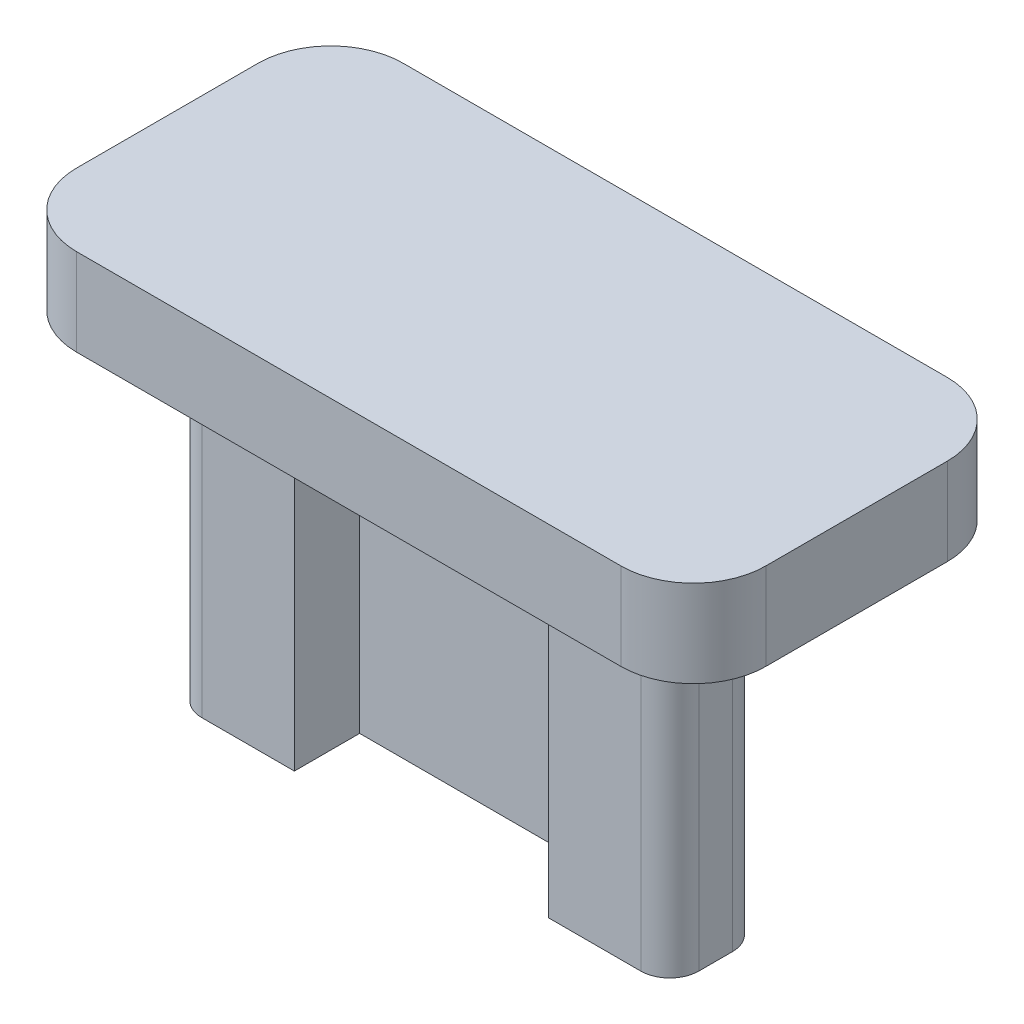
ISO-10303-21;
HEADER;
FILE_DESCRIPTION(('STEP AP214'),'2;1');
FILE_NAME('part.step','',(''),(''),'','','');
FILE_SCHEMA(('AUTOMOTIVE_DESIGN { 1 0 10303 214 1 1 1 1 }'));
ENDSEC;
DATA;
#1=APPLICATION_CONTEXT('core data for automotive mechanical design processes');
#2=APPLICATION_PROTOCOL_DEFINITION('international standard','automotive_design',2000,#1);
#3=PRODUCT_CONTEXT('',#1,'mechanical');
#4=PRODUCT('Part','Part','',(#3));
#5=PRODUCT_RELATED_PRODUCT_CATEGORY('part','',(#4));
#6=PRODUCT_DEFINITION_FORMATION('','',#4);
#7=PRODUCT_DEFINITION_CONTEXT('part definition',#1,'design');
#8=PRODUCT_DEFINITION('design','',#6,#7);
#9=PRODUCT_DEFINITION_SHAPE('','',#8);
#10=(LENGTH_UNIT() NAMED_UNIT(*) SI_UNIT(.MILLI.,.METRE.));
#11=(NAMED_UNIT(*) PLANE_ANGLE_UNIT() SI_UNIT($,.RADIAN.));
#12=(NAMED_UNIT(*) SI_UNIT($,.STERADIAN.) SOLID_ANGLE_UNIT());
#13=UNCERTAINTY_MEASURE_WITH_UNIT(LENGTH_MEASURE(1.E-05),#10,'distance_accuracy_value','');
#14=(GEOMETRIC_REPRESENTATION_CONTEXT(3) GLOBAL_UNCERTAINTY_ASSIGNED_CONTEXT((#13)) GLOBAL_UNIT_ASSIGNED_CONTEXT((#10,
#11,#12)) REPRESENTATION_CONTEXT('',''));
#15=CARTESIAN_POINT('',(0.,0.,0.));
#16=DIRECTION('',(0.,0.,1.));
#17=DIRECTION('',(1.,0.,0.));
#18=AXIS2_PLACEMENT_3D('',#15,#16,#17);
#19=CARTESIAN_POINT('',(-3.425,-2.4,0.9));
#20=DIRECTION('',(0.,0.,-1.));
#21=DIRECTION('',(-1.,0.,0.));
#22=AXIS2_PLACEMENT_3D('',#19,#20,#21);
#23=PLANE('',#22);
#24=DIRECTION('',(-1.,0.,0.));
#25=VECTOR('',#24,1.);
#26=CARTESIAN_POINT('',(-3.425,2.1,0.9));
#27=LINE('',#26,#25);
#28=CARTESIAN_POINT('',(-1.75,2.1,0.9));
#29=VERTEX_POINT('',#28);
#30=CARTESIAN_POINT('',(-3.025,2.1,0.9));
#31=VERTEX_POINT('',#30);
#32=EDGE_CURVE('E217',#29,#31,#27,.T.);
#33=ORIENTED_EDGE('',*,*,#32,.T.);
#34=DIRECTION('',(0.,1.,0.));
#35=VECTOR('',#34,1.);
#36=CARTESIAN_POINT('',(-3.025,-2.4,0.9));
#37=LINE('',#36,#35);
#38=CARTESIAN_POINT('',(-3.025,-2.4,0.9));
#39=VERTEX_POINT('',#38);
#40=EDGE_CURVE('E334',#31,#39,#37,.F.);
#41=ORIENTED_EDGE('',*,*,#40,.T.);
#42=DIRECTION('',(-1.,0.,0.));
#43=VECTOR('',#42,1.);
#44=CARTESIAN_POINT('',(-3.425,-2.4,0.9));
#45=LINE('',#44,#43);
#46=CARTESIAN_POINT('',(-1.75,-2.4,0.9));
#47=VERTEX_POINT('',#46);
#48=EDGE_CURVE('E220',#47,#39,#45,.T.);
#49=ORIENTED_EDGE('',*,*,#48,.F.);
#50=DIRECTION('',(0.,-1.,0.));
#51=VECTOR('',#50,1.);
#52=CARTESIAN_POINT('',(-1.75,5.71386219991853,0.9));
#53=LINE('',#52,#51);
#54=EDGE_CURVE('E206',#29,#47,#53,.T.);
#55=ORIENTED_EDGE('',*,*,#54,.F.);
#56=EDGE_LOOP('',(#33,#41,#49,#55));
#57=FACE_BOUND('',#56,.T.);
#58=ADVANCED_FACE('F39',(#57),#23,.F.);
#59=CARTESIAN_POINT('',(0.,2.1,0.));
#60=DIRECTION('',(0.,1.,0.));
#61=DIRECTION('',(0.,0.,1.));
#62=AXIS2_PLACEMENT_3D('',#59,#60,#61);
#63=PLANE('',#62);
#64=DIRECTION('',(-1.,0.,0.));
#65=VECTOR('',#64,1.);
#66=CARTESIAN_POINT('',(4.75,2.1,-2.6));
#67=LINE('',#66,#65);
#68=CARTESIAN_POINT('',(3.75,2.1,-2.6));
#69=VERTEX_POINT('',#68);
#70=CARTESIAN_POINT('',(-3.75,2.1,-2.6));
#71=VERTEX_POINT('',#70);
#72=EDGE_CURVE('E265',#69,#71,#67,.T.);
#73=ORIENTED_EDGE('',*,*,#72,.F.);
#74=CARTESIAN_POINT('',(3.75,2.1,-1.6));
#75=DIRECTION('',(0.,1.,0.));
#76=DIRECTION('',(0.,0.,1.));
#77=AXIS2_PLACEMENT_3D('',#74,#75,#76);
#78=CIRCLE('',#77,1.);
#79=CARTESIAN_POINT('',(4.75,2.1,-1.6));
#80=VERTEX_POINT('',#79);
#81=EDGE_CURVE('E399',#69,#80,#78,.F.);
#82=ORIENTED_EDGE('',*,*,#81,.T.);
#83=DIRECTION('',(0.,0.,-1.));
#84=VECTOR('',#83,1.);
#85=CARTESIAN_POINT('',(4.75,2.1,1.9));
#86=LINE('',#85,#84);
#87=CARTESIAN_POINT('',(4.75,2.1,0.9));
#88=VERTEX_POINT('',#87);
#89=EDGE_CURVE('E260',#88,#80,#86,.T.);
#90=ORIENTED_EDGE('',*,*,#89,.F.);
#91=CARTESIAN_POINT('',(3.75,2.1,0.9));
#92=DIRECTION('',(0.,1.,0.));
#93=DIRECTION('',(0.,0.,1.));
#94=AXIS2_PLACEMENT_3D('',#91,#92,#93);
#95=CIRCLE('',#94,1.);
#96=CARTESIAN_POINT('',(3.75,2.1,1.9));
#97=VERTEX_POINT('',#96);
#98=EDGE_CURVE('E391',#88,#97,#95,.F.);
#99=ORIENTED_EDGE('',*,*,#98,.T.);
#100=DIRECTION('',(1.,0.,0.));
#101=VECTOR('',#100,1.);
#102=CARTESIAN_POINT('',(-4.75,2.1,1.9));
#103=LINE('',#102,#101);
#104=CARTESIAN_POINT('',(-3.75,2.1,1.9));
#105=VERTEX_POINT('',#104);
#106=EDGE_CURVE('E256',#105,#97,#103,.T.);
#107=ORIENTED_EDGE('',*,*,#106,.F.);
#108=CARTESIAN_POINT('',(-3.75,2.1,0.9));
#109=DIRECTION('',(0.,1.,0.));
#110=DIRECTION('',(0.,0.,1.));
#111=AXIS2_PLACEMENT_3D('',#108,#109,#110);
#112=CIRCLE('',#111,1.);
#113=CARTESIAN_POINT('',(-4.75,2.1,0.9));
#114=VERTEX_POINT('',#113);
#115=EDGE_CURVE('E55',#105,#114,#112,.F.);
#116=ORIENTED_EDGE('',*,*,#115,.T.);
#117=DIRECTION('',(0.,0.,1.));
#118=VECTOR('',#117,1.);
#119=CARTESIAN_POINT('',(-4.75,2.1,-2.6));
#120=LINE('',#119,#118);
#121=CARTESIAN_POINT('',(-4.75,2.1,-1.6));
#122=VERTEX_POINT('',#121);
#123=EDGE_CURVE('E269',#122,#114,#120,.T.);
#124=ORIENTED_EDGE('',*,*,#123,.F.);
#125=CARTESIAN_POINT('',(-3.75,2.1,-1.6));
#126=DIRECTION('',(0.,1.,0.));
#127=DIRECTION('',(0.,0.,1.));
#128=AXIS2_PLACEMENT_3D('',#125,#126,#127);
#129=CIRCLE('',#128,1.);
#130=EDGE_CURVE('E396',#122,#71,#129,.F.);
#131=ORIENTED_EDGE('',*,*,#130,.T.);
#132=EDGE_LOOP('',(#73,#82,#90,#99,#107,#116,#124,#131));
#133=FACE_BOUND('',#132,.T.);
#134=DIRECTION('',(0.,0.,1.));
#135=VECTOR('',#134,1.);
#136=CARTESIAN_POINT('',(3.425,2.1,0.9));
#137=LINE('',#136,#135);
#138=CARTESIAN_POINT('',(3.425,2.1,0.0364442311467823));
#139=VERTEX_POINT('',#138);
#140=CARTESIAN_POINT('',(3.425,2.1,0.5));
#141=VERTEX_POINT('',#140);
#142=EDGE_CURVE('E230',#139,#141,#137,.T.);
#143=ORIENTED_EDGE('',*,*,#142,.F.);
#144=CARTESIAN_POINT('',(3.025,2.1,0.0364442311467823));
#145=DIRECTION('',(0.,1.,0.));
#146=DIRECTION('',(0.,0.,1.));
#147=AXIS2_PLACEMENT_3D('',#144,#145,#146);
#148=CIRCLE('',#147,0.4);
#149=CARTESIAN_POINT('',(3.30692588754893,2.1,-0.247312343983638));
#150=VERTEX_POINT('',#149);
#151=EDGE_CURVE('E351',#139,#150,#148,.T.);
#152=ORIENTED_EDGE('',*,*,#151,.T.);
#153=DIRECTION('',(0.70939143782605,0.,0.704814718872336));
#154=VECTOR('',#153,1.);
#155=CARTESIAN_POINT('',(3.425,2.1,-0.129999999999998));
#156=LINE('',#155,#154);
#157=CARTESIAN_POINT('',(2.7669982523038,2.1,-0.78375657513042));
#158=VERTEX_POINT('',#157);
#159=EDGE_CURVE('E251',#158,#150,#156,.T.);
#160=ORIENTED_EDGE('',*,*,#159,.F.);
#161=CARTESIAN_POINT('',(2.48507236475486,2.1,-0.5));
#162=DIRECTION('',(0.,1.,0.));
#163=DIRECTION('',(0.,0.,1.));
#164=AXIS2_PLACEMENT_3D('',#161,#162,#163);
#165=CIRCLE('',#164,0.4);
#166=CARTESIAN_POINT('',(2.48507236475486,2.1,-0.9));
#167=VERTEX_POINT('',#166);
#168=EDGE_CURVE('E362',#158,#167,#165,.T.);
#169=ORIENTED_EDGE('',*,*,#168,.T.);
#170=DIRECTION('',(1.,0.,0.));
#171=VECTOR('',#170,1.);
#172=CARTESIAN_POINT('',(2.65,2.1,-0.9));
#173=LINE('',#172,#171);
#174=CARTESIAN_POINT('',(-2.48507236475486,2.1,-0.9));
#175=VERTEX_POINT('',#174);
#176=EDGE_CURVE('E247',#175,#167,#173,.T.);
#177=ORIENTED_EDGE('',*,*,#176,.F.);
#178=CARTESIAN_POINT('',(-2.48507236475486,2.1,-0.5));
#179=DIRECTION('',(0.,1.,0.));
#180=DIRECTION('',(0.,0.,1.));
#181=AXIS2_PLACEMENT_3D('',#178,#179,#180);
#182=CIRCLE('',#181,0.4);
#183=CARTESIAN_POINT('',(-2.7669982523038,2.1,-0.783756575130421));
#184=VERTEX_POINT('',#183);
#185=EDGE_CURVE('E356',#175,#184,#182,.T.);
#186=ORIENTED_EDGE('',*,*,#185,.T.);
#187=DIRECTION('',(0.709391437826053,0.,-0.704814718872333));
#188=VECTOR('',#187,1.);
#189=CARTESIAN_POINT('',(-2.65,2.1,-0.9));
#190=LINE('',#189,#188);
#191=CARTESIAN_POINT('',(-3.30692588754893,2.1,-0.247312343983642));
#192=VERTEX_POINT('',#191);
#193=EDGE_CURVE('E243',#192,#184,#190,.T.);
#194=ORIENTED_EDGE('',*,*,#193,.F.);
#195=CARTESIAN_POINT('',(-3.025,2.1,0.0364442311467787));
#196=DIRECTION('',(0.,1.,0.));
#197=DIRECTION('',(0.,0.,1.));
#198=AXIS2_PLACEMENT_3D('',#195,#196,#197);
#199=CIRCLE('',#198,0.4);
#200=CARTESIAN_POINT('',(-3.425,2.1,0.0364442311467787));
#201=VERTEX_POINT('',#200);
#202=EDGE_CURVE('E348',#192,#201,#199,.T.);
#203=ORIENTED_EDGE('',*,*,#202,.T.);
#204=DIRECTION('',(0.,0.,-1.));
#205=VECTOR('',#204,1.);
#206=CARTESIAN_POINT('',(-3.425,2.1,-0.130000000000002));
#207=LINE('',#206,#205);
#208=CARTESIAN_POINT('',(-3.425,2.1,0.5));
#209=VERTEX_POINT('',#208);
#210=EDGE_CURVE('E234',#209,#201,#207,.T.);
#211=ORIENTED_EDGE('',*,*,#210,.F.);
#212=CARTESIAN_POINT('',(-3.025,2.1,0.5));
#213=DIRECTION('',(0.,1.,0.));
#214=DIRECTION('',(0.,0.,1.));
#215=AXIS2_PLACEMENT_3D('',#212,#213,#214);
#216=CIRCLE('',#215,0.4);
#217=EDGE_CURVE('E227',#209,#31,#216,.T.);
#218=ORIENTED_EDGE('',*,*,#217,.T.);
#219=ORIENTED_EDGE('',*,*,#32,.F.);
#220=DIRECTION('',(0.,0.,-1.));
#221=VECTOR('',#220,1.);
#222=CARTESIAN_POINT('',(-1.75,2.1,0.9));
#223=LINE('',#222,#221);
#224=CARTESIAN_POINT('',(-1.75,2.1,0.));
#225=VERTEX_POINT('',#224);
#226=EDGE_CURVE('E202',#29,#225,#223,.T.);
#227=ORIENTED_EDGE('',*,*,#226,.T.);
#228=DIRECTION('',(1.,0.,0.));
#229=VECTOR('',#228,1.);
#230=CARTESIAN_POINT('',(-1.75,2.1,0.));
#231=LINE('',#230,#229);
#232=CARTESIAN_POINT('',(1.75,2.1,0.));
#233=VERTEX_POINT('',#232);
#234=EDGE_CURVE('E544',#225,#233,#231,.T.);
#235=ORIENTED_EDGE('',*,*,#234,.T.);
#236=DIRECTION('',(0.,0.,1.));
#237=VECTOR('',#236,1.);
#238=CARTESIAN_POINT('',(1.75,2.1,0.));
#239=LINE('',#238,#237);
#240=CARTESIAN_POINT('',(1.75,2.1,0.9));
#241=VERTEX_POINT('',#240);
#242=EDGE_CURVE('E540',#233,#241,#239,.T.);
#243=ORIENTED_EDGE('',*,*,#242,.T.);
#244=CARTESIAN_POINT('',(3.025,2.1,0.9));
#245=VERTEX_POINT('',#244);
#246=EDGE_CURVE('E229',#245,#241,#27,.T.);
#247=ORIENTED_EDGE('',*,*,#246,.F.);
#248=CARTESIAN_POINT('',(3.025,2.1,0.5));
#249=DIRECTION('',(0.,1.,0.));
#250=DIRECTION('',(0.,0.,1.));
#251=AXIS2_PLACEMENT_3D('',#248,#249,#250);
#252=CIRCLE('',#251,0.4);
#253=EDGE_CURVE('E359',#245,#141,#252,.T.);
#254=ORIENTED_EDGE('',*,*,#253,.T.);
#255=EDGE_LOOP('',(#143,#152,#160,#169,#177,#186,#194,#203,#211,#218,#219,#227,#235,#243,#247,#254));
#256=FACE_BOUND('',#255,.T.);
#257=ADVANCED_FACE('F225',(#133,#256),#63,.F.);
#258=CARTESIAN_POINT('',(-4.75,2.1,1.9));
#259=DIRECTION('',(0.,0.,1.));
#260=DIRECTION('',(1.,0.,0.));
#261=AXIS2_PLACEMENT_3D('',#258,#259,#260);
#262=PLANE('',#261);
#263=DIRECTION('',(1.,0.,0.));
#264=VECTOR('',#263,1.);
#265=CARTESIAN_POINT('',(-4.75,3.3,1.9));
#266=LINE('',#265,#264);
#267=CARTESIAN_POINT('',(-3.75,3.3,1.9));
#268=VERTEX_POINT('',#267);
#269=CARTESIAN_POINT('',(3.75,3.3,1.9));
#270=VERTEX_POINT('',#269);
#271=EDGE_CURVE('E273',#268,#270,#266,.T.);
#272=ORIENTED_EDGE('',*,*,#271,.F.);
#273=DIRECTION('',(0.,1.,0.));
#274=VECTOR('',#273,1.);
#275=CARTESIAN_POINT('',(-3.75,2.1,1.9));
#276=LINE('',#275,#274);
#277=EDGE_CURVE('E11',#268,#105,#276,.F.);
#278=ORIENTED_EDGE('',*,*,#277,.T.);
#279=ORIENTED_EDGE('',*,*,#106,.T.);
#280=DIRECTION('',(0.,1.,0.));
#281=VECTOR('',#280,1.);
#282=CARTESIAN_POINT('',(3.75,2.1,1.9));
#283=LINE('',#282,#281);
#284=EDGE_CURVE('E48',#97,#270,#283,.T.);
#285=ORIENTED_EDGE('',*,*,#284,.T.);
#286=EDGE_LOOP('',(#272,#278,#279,#285));
#287=FACE_BOUND('',#286,.T.);
#288=ADVANCED_FACE('F412',(#287),#262,.T.);
#289=CARTESIAN_POINT('',(-4.75,2.1,-2.6));
#290=DIRECTION('',(-1.,0.,0.));
#291=DIRECTION('',(0.,0.,1.));
#292=AXIS2_PLACEMENT_3D('',#289,#290,#291);
#293=PLANE('',#292);
#294=DIRECTION('',(0.,0.,1.));
#295=VECTOR('',#294,1.);
#296=CARTESIAN_POINT('',(-4.75,3.3,-2.6));
#297=LINE('',#296,#295);
#298=CARTESIAN_POINT('',(-4.75,3.3,-1.6));
#299=VERTEX_POINT('',#298);
#300=CARTESIAN_POINT('',(-4.75,3.3,0.9));
#301=VERTEX_POINT('',#300);
#302=EDGE_CURVE('E261',#299,#301,#297,.T.);
#303=ORIENTED_EDGE('',*,*,#302,.F.);
#304=DIRECTION('',(0.,1.,0.));
#305=VECTOR('',#304,1.);
#306=CARTESIAN_POINT('',(-4.75,2.1,-1.6));
#307=LINE('',#306,#305);
#308=EDGE_CURVE('E62',#299,#122,#307,.F.);
#309=ORIENTED_EDGE('',*,*,#308,.T.);
#310=ORIENTED_EDGE('',*,*,#123,.T.);
#311=DIRECTION('',(0.,1.,0.));
#312=VECTOR('',#311,1.);
#313=CARTESIAN_POINT('',(-4.75,2.1,0.9));
#314=LINE('',#313,#312);
#315=EDGE_CURVE('E402',#114,#301,#314,.T.);
#316=ORIENTED_EDGE('',*,*,#315,.T.);
#317=EDGE_LOOP('',(#303,#309,#310,#316));
#318=FACE_BOUND('',#317,.T.);
#319=ADVANCED_FACE('F422',(#318),#293,.T.);
#320=CARTESIAN_POINT('',(4.75,2.1,-2.6));
#321=DIRECTION('',(0.,0.,-1.));
#322=DIRECTION('',(-1.,0.,0.));
#323=AXIS2_PLACEMENT_3D('',#320,#321,#322);
#324=PLANE('',#323);
#325=DIRECTION('',(-1.,0.,0.));
#326=VECTOR('',#325,1.);
#327=CARTESIAN_POINT('',(4.75,3.3,-2.6));
#328=LINE('',#327,#326);
#329=CARTESIAN_POINT('',(3.75,3.3,-2.6));
#330=VERTEX_POINT('',#329);
#331=CARTESIAN_POINT('',(-3.75,3.3,-2.6));
#332=VERTEX_POINT('',#331);
#333=EDGE_CURVE('E282',#330,#332,#328,.T.);
#334=ORIENTED_EDGE('',*,*,#333,.F.);
#335=DIRECTION('',(0.,1.,0.));
#336=VECTOR('',#335,1.);
#337=CARTESIAN_POINT('',(3.75,2.1,-2.6));
#338=LINE('',#337,#336);
#339=EDGE_CURVE('E388',#330,#69,#338,.F.);
#340=ORIENTED_EDGE('',*,*,#339,.T.);
#341=ORIENTED_EDGE('',*,*,#72,.T.);
#342=DIRECTION('',(0.,1.,0.));
#343=VECTOR('',#342,1.);
#344=CARTESIAN_POINT('',(-3.75,2.1,-2.6));
#345=LINE('',#344,#343);
#346=EDGE_CURVE('E384',#71,#332,#345,.T.);
#347=ORIENTED_EDGE('',*,*,#346,.T.);
#348=EDGE_LOOP('',(#334,#340,#341,#347));
#349=FACE_BOUND('',#348,.T.);
#350=ADVANCED_FACE('F430',(#349),#324,.T.);
#351=CARTESIAN_POINT('',(4.75,2.1,1.9));
#352=DIRECTION('',(1.,0.,0.));
#353=DIRECTION('',(0.,0.,-1.));
#354=AXIS2_PLACEMENT_3D('',#351,#352,#353);
#355=PLANE('',#354);
#356=ORIENTED_EDGE('',*,*,#89,.T.);
#357=DIRECTION('',(0.,1.,0.));
#358=VECTOR('',#357,1.);
#359=CARTESIAN_POINT('',(4.75,2.1,-1.6));
#360=LINE('',#359,#358);
#361=CARTESIAN_POINT('',(4.75,3.3,-1.6));
#362=VERTEX_POINT('',#361);
#363=EDGE_CURVE('E368',#80,#362,#360,.T.);
#364=ORIENTED_EDGE('',*,*,#363,.T.);
#365=DIRECTION('',(0.,0.,-1.));
#366=VECTOR('',#365,1.);
#367=CARTESIAN_POINT('',(4.75,3.3,1.9));
#368=LINE('',#367,#366);
#369=CARTESIAN_POINT('',(4.75,3.3,0.9));
#370=VERTEX_POINT('',#369);
#371=EDGE_CURVE('E277',#370,#362,#368,.T.);
#372=ORIENTED_EDGE('',*,*,#371,.F.);
#373=DIRECTION('',(0.,1.,0.));
#374=VECTOR('',#373,1.);
#375=CARTESIAN_POINT('',(4.75,2.1,0.9));
#376=LINE('',#375,#374);
#377=EDGE_CURVE('E365',#370,#88,#376,.F.);
#378=ORIENTED_EDGE('',*,*,#377,.T.);
#379=EDGE_LOOP('',(#356,#364,#372,#378));
#380=FACE_BOUND('',#379,.T.);
#381=ADVANCED_FACE('F437',(#380),#355,.T.);
#382=CARTESIAN_POINT('',(0.,3.3,0.));
#383=DIRECTION('',(0.,1.,0.));
#384=DIRECTION('',(0.,0.,1.));
#385=AXIS2_PLACEMENT_3D('',#382,#383,#384);
#386=PLANE('',#385);
#387=ORIENTED_EDGE('',*,*,#371,.T.);
#388=CARTESIAN_POINT('',(3.75,3.3,-1.6));
#389=DIRECTION('',(0.,1.,0.));
#390=DIRECTION('',(0.,0.,1.));
#391=AXIS2_PLACEMENT_3D('',#388,#389,#390);
#392=CIRCLE('',#391,1.);
#393=EDGE_CURVE('E381',#362,#330,#392,.T.);
#394=ORIENTED_EDGE('',*,*,#393,.T.);
#395=ORIENTED_EDGE('',*,*,#333,.T.);
#396=CARTESIAN_POINT('',(-3.75,3.3,-1.6));
#397=DIRECTION('',(0.,1.,0.));
#398=DIRECTION('',(0.,0.,1.));
#399=AXIS2_PLACEMENT_3D('',#396,#397,#398);
#400=CIRCLE('',#399,1.);
#401=EDGE_CURVE('E378',#332,#299,#400,.T.);
#402=ORIENTED_EDGE('',*,*,#401,.T.);
#403=ORIENTED_EDGE('',*,*,#302,.T.);
#404=CARTESIAN_POINT('',(-3.75,3.3,0.9));
#405=DIRECTION('',(0.,1.,0.));
#406=DIRECTION('',(0.,0.,1.));
#407=AXIS2_PLACEMENT_3D('',#404,#405,#406);
#408=CIRCLE('',#407,1.);
#409=EDGE_CURVE('E375',#301,#268,#408,.T.);
#410=ORIENTED_EDGE('',*,*,#409,.T.);
#411=ORIENTED_EDGE('',*,*,#271,.T.);
#412=CARTESIAN_POINT('',(3.75,3.3,0.9));
#413=DIRECTION('',(0.,1.,0.));
#414=DIRECTION('',(0.,0.,1.));
#415=AXIS2_PLACEMENT_3D('',#412,#413,#414);
#416=CIRCLE('',#415,1.);
#417=EDGE_CURVE('E372',#270,#370,#416,.T.);
#418=ORIENTED_EDGE('',*,*,#417,.T.);
#419=EDGE_LOOP('',(#387,#394,#395,#402,#403,#410,#411,#418));
#420=FACE_BOUND('',#419,.T.);
#421=ADVANCED_FACE('F417',(#420),#386,.T.);
#422=CARTESIAN_POINT('',(3.425,-2.4,0.9));
#423=DIRECTION('',(-1.,0.,0.));
#424=DIRECTION('',(0.,0.,1.));
#425=AXIS2_PLACEMENT_3D('',#422,#423,#424);
#426=PLANE('',#425);
#427=DIRECTION('',(0.,0.,1.));
#428=VECTOR('',#427,1.);
#429=CARTESIAN_POINT('',(3.425,-2.4,0.9));
#430=LINE('',#429,#428);
#431=CARTESIAN_POINT('',(3.425,-2.4,0.0364442311467823));
#432=VERTEX_POINT('',#431);
#433=CARTESIAN_POINT('',(3.425,-2.4,0.5));
#434=VERTEX_POINT('',#433);
#435=EDGE_CURVE('E255',#432,#434,#430,.T.);
#436=ORIENTED_EDGE('',*,*,#435,.F.);
#437=DIRECTION('',(0.,1.,0.));
#438=VECTOR('',#437,1.);
#439=CARTESIAN_POINT('',(3.425,-2.4,0.0364442311467823));
#440=LINE('',#439,#438);
#441=EDGE_CURVE('E323',#432,#139,#440,.T.);
#442=ORIENTED_EDGE('',*,*,#441,.T.);
#443=ORIENTED_EDGE('',*,*,#142,.T.);
#444=DIRECTION('',(0.,1.,0.));
#445=VECTOR('',#444,1.);
#446=CARTESIAN_POINT('',(3.425,-2.4,0.5));
#447=LINE('',#446,#445);
#448=EDGE_CURVE('E320',#141,#434,#447,.F.);
#449=ORIENTED_EDGE('',*,*,#448,.T.);
#450=EDGE_LOOP('',(#436,#442,#443,#449));
#451=FACE_BOUND('',#450,.T.);
#452=ADVANCED_FACE('F455',(#451),#426,.F.);
#453=CARTESIAN_POINT('',(3.025,-2.4,0.9));
#454=VERTEX_POINT('',#453);
#455=CARTESIAN_POINT('',(1.75,-2.4,0.9));
#456=VERTEX_POINT('',#455);
#457=EDGE_CURVE('E466',#454,#456,#45,.T.);
#458=ORIENTED_EDGE('',*,*,#457,.F.);
#459=DIRECTION('',(0.,1.,0.));
#460=VECTOR('',#459,1.);
#461=CARTESIAN_POINT('',(3.025,-2.4,0.9));
#462=LINE('',#461,#460);
#463=EDGE_CURVE('E344',#454,#245,#462,.T.);
#464=ORIENTED_EDGE('',*,*,#463,.T.);
#465=ORIENTED_EDGE('',*,*,#246,.T.);
#466=DIRECTION('',(0.,-1.,0.));
#467=VECTOR('',#466,1.);
#468=CARTESIAN_POINT('',(1.75,5.71386219991853,0.9));
#469=LINE('',#468,#467);
#470=EDGE_CURVE('E236',#241,#456,#469,.T.);
#471=ORIENTED_EDGE('',*,*,#470,.T.);
#472=EDGE_LOOP('',(#458,#464,#465,#471));
#473=FACE_BOUND('',#472,.T.);
#474=ADVANCED_FACE('F446',(#473),#23,.F.);
#475=CARTESIAN_POINT('',(-3.425,-2.4,-0.130000000000002));
#476=DIRECTION('',(1.,0.,0.));
#477=DIRECTION('',(0.,0.,-1.));
#478=AXIS2_PLACEMENT_3D('',#475,#476,#477);
#479=PLANE('',#478);
#480=ORIENTED_EDGE('',*,*,#210,.T.);
#481=DIRECTION('',(0.,1.,0.));
#482=VECTOR('',#481,1.);
#483=CARTESIAN_POINT('',(-3.425,-2.4,0.0364442311467787));
#484=LINE('',#483,#482);
#485=CARTESIAN_POINT('',(-3.425,-2.4,0.0364442311467787));
#486=VERTEX_POINT('',#485);
#487=EDGE_CURVE('E299',#201,#486,#484,.F.);
#488=ORIENTED_EDGE('',*,*,#487,.T.);
#489=DIRECTION('',(0.,0.,-1.));
#490=VECTOR('',#489,1.);
#491=CARTESIAN_POINT('',(-3.425,-2.4,-0.130000000000002));
#492=LINE('',#491,#490);
#493=CARTESIAN_POINT('',(-3.425,-2.4,0.5));
#494=VERTEX_POINT('',#493);
#495=EDGE_CURVE('E474',#494,#486,#492,.T.);
#496=ORIENTED_EDGE('',*,*,#495,.F.);
#497=DIRECTION('',(0.,1.,0.));
#498=VECTOR('',#497,1.);
#499=CARTESIAN_POINT('',(-3.425,-2.4,0.5));
#500=LINE('',#499,#498);
#501=EDGE_CURVE('E295',#494,#209,#500,.T.);
#502=ORIENTED_EDGE('',*,*,#501,.T.);
#503=EDGE_LOOP('',(#480,#488,#496,#502));
#504=FACE_BOUND('',#503,.T.);
#505=ADVANCED_FACE('F454',(#504),#479,.F.);
#506=CARTESIAN_POINT('',(-2.65,-2.4,-0.9));
#507=DIRECTION('',(0.704814718872333,0.,0.709391437826053));
#508=DIRECTION('',(0.709391437826053,0.,-0.704814718872333));
#509=AXIS2_PLACEMENT_3D('',#506,#507,#508);
#510=PLANE('',#509);
#511=DIRECTION('',(0.709391437826053,0.,-0.704814718872333));
#512=VECTOR('',#511,1.);
#513=CARTESIAN_POINT('',(-2.65,-2.4,-0.9));
#514=LINE('',#513,#512);
#515=CARTESIAN_POINT('',(-3.30692588754893,-2.4,-0.247312343983642));
#516=VERTEX_POINT('',#515);
#517=CARTESIAN_POINT('',(-2.7669982523038,-2.4,-0.783756575130421));
#518=VERTEX_POINT('',#517);
#519=EDGE_CURVE('E514',#516,#518,#514,.T.);
#520=ORIENTED_EDGE('',*,*,#519,.F.);
#521=DIRECTION('',(0.,1.,0.));
#522=VECTOR('',#521,1.);
#523=CARTESIAN_POINT('',(-3.30692588754893,-2.4,-0.247312343983642));
#524=LINE('',#523,#522);
#525=EDGE_CURVE('E291',#516,#192,#524,.T.);
#526=ORIENTED_EDGE('',*,*,#525,.T.);
#527=ORIENTED_EDGE('',*,*,#193,.T.);
#528=DIRECTION('',(0.,1.,0.));
#529=VECTOR('',#528,1.);
#530=CARTESIAN_POINT('',(-2.7669982523038,-2.4,-0.783756575130421));
#531=LINE('',#530,#529);
#532=EDGE_CURVE('E272',#184,#518,#531,.F.);
#533=ORIENTED_EDGE('',*,*,#532,.T.);
#534=EDGE_LOOP('',(#520,#526,#527,#533));
#535=FACE_BOUND('',#534,.T.);
#536=ADVANCED_FACE('F461',(#535),#510,.F.);
#537=CARTESIAN_POINT('',(2.65,-2.4,-0.9));
#538=DIRECTION('',(0.,0.,1.));
#539=DIRECTION('',(1.,0.,0.));
#540=AXIS2_PLACEMENT_3D('',#537,#538,#539);
#541=PLANE('',#540);
#542=DIRECTION('',(1.,0.,0.));
#543=VECTOR('',#542,1.);
#544=CARTESIAN_POINT('',(2.65,-2.4,-0.9));
#545=LINE('',#544,#543);
#546=CARTESIAN_POINT('',(-2.48507236475486,-2.4,-0.9));
#547=VERTEX_POINT('',#546);
#548=CARTESIAN_POINT('',(2.48507236475486,-2.4,-0.9));
#549=VERTEX_POINT('',#548);
#550=EDGE_CURVE('E504',#547,#549,#545,.T.);
#551=ORIENTED_EDGE('',*,*,#550,.F.);
#552=DIRECTION('',(0.,1.,0.));
#553=VECTOR('',#552,1.);
#554=CARTESIAN_POINT('',(-2.48507236475486,-2.4,-0.9));
#555=LINE('',#554,#553);
#556=EDGE_CURVE('E340',#547,#175,#555,.T.);
#557=ORIENTED_EDGE('',*,*,#556,.T.);
#558=ORIENTED_EDGE('',*,*,#176,.T.);
#559=DIRECTION('',(0.,1.,0.));
#560=VECTOR('',#559,1.);
#561=CARTESIAN_POINT('',(2.48507236475486,-2.4,-0.9));
#562=LINE('',#561,#560);
#563=EDGE_CURVE('E337',#167,#549,#562,.F.);
#564=ORIENTED_EDGE('',*,*,#563,.T.);
#565=EDGE_LOOP('',(#551,#557,#558,#564));
#566=FACE_BOUND('',#565,.T.);
#567=ADVANCED_FACE('F501',(#566),#541,.F.);
#568=CARTESIAN_POINT('',(3.425,-2.4,-0.129999999999998));
#569=DIRECTION('',(-0.704814718872336,0.,0.70939143782605));
#570=DIRECTION('',(0.70939143782605,0.,0.704814718872336));
#571=AXIS2_PLACEMENT_3D('',#568,#569,#570);
#572=PLANE('',#571);
#573=ORIENTED_EDGE('',*,*,#159,.T.);
#574=DIRECTION('',(0.,1.,0.));
#575=VECTOR('',#574,1.);
#576=CARTESIAN_POINT('',(3.30692588754893,-2.4,-0.247312343983638));
#577=LINE('',#576,#575);
#578=CARTESIAN_POINT('',(3.30692588754893,-2.4,-0.247312343983638));
#579=VERTEX_POINT('',#578);
#580=EDGE_CURVE('E331',#150,#579,#577,.F.);
#581=ORIENTED_EDGE('',*,*,#580,.T.);
#582=DIRECTION('',(0.70939143782605,0.,0.704814718872336));
#583=VECTOR('',#582,1.);
#584=CARTESIAN_POINT('',(3.425,-2.4,-0.129999999999998));
#585=LINE('',#584,#583);
#586=CARTESIAN_POINT('',(2.7669982523038,-2.4,-0.78375657513042));
#587=VERTEX_POINT('',#586);
#588=EDGE_CURVE('E278',#587,#579,#585,.T.);
#589=ORIENTED_EDGE('',*,*,#588,.F.);
#590=DIRECTION('',(0.,1.,0.));
#591=VECTOR('',#590,1.);
#592=CARTESIAN_POINT('',(2.7669982523038,-2.4,-0.78375657513042));
#593=LINE('',#592,#591);
#594=EDGE_CURVE('E327',#587,#158,#593,.T.);
#595=ORIENTED_EDGE('',*,*,#594,.T.);
#596=EDGE_LOOP('',(#573,#581,#589,#595));
#597=FACE_BOUND('',#596,.T.);
#598=ADVANCED_FACE('F490',(#597),#572,.F.);
#599=CARTESIAN_POINT('',(0.,-2.4,0.));
#600=DIRECTION('',(0.,1.,0.));
#601=DIRECTION('',(0.,0.,1.));
#602=AXIS2_PLACEMENT_3D('',#599,#600,#601);
#603=PLANE('',#602);
#604=ORIENTED_EDGE('',*,*,#495,.T.);
#605=CARTESIAN_POINT('',(-3.025,-2.4,0.0364442311467787));
#606=DIRECTION('',(0.,1.,0.));
#607=DIRECTION('',(0.,0.,1.));
#608=AXIS2_PLACEMENT_3D('',#605,#606,#607);
#609=CIRCLE('',#608,0.4);
#610=EDGE_CURVE('E317',#486,#516,#609,.F.);
#611=ORIENTED_EDGE('',*,*,#610,.T.);
#612=ORIENTED_EDGE('',*,*,#519,.T.);
#613=CARTESIAN_POINT('',(-2.48507236475486,-2.4,-0.5));
#614=DIRECTION('',(0.,1.,0.));
#615=DIRECTION('',(0.,0.,1.));
#616=AXIS2_PLACEMENT_3D('',#613,#614,#615);
#617=CIRCLE('',#616,0.4);
#618=EDGE_CURVE('E308',#518,#547,#617,.F.);
#619=ORIENTED_EDGE('',*,*,#618,.T.);
#620=ORIENTED_EDGE('',*,*,#550,.T.);
#621=CARTESIAN_POINT('',(2.48507236475486,-2.4,-0.5));
#622=DIRECTION('',(0.,1.,0.));
#623=DIRECTION('',(0.,0.,1.));
#624=AXIS2_PLACEMENT_3D('',#621,#622,#623);
#625=CIRCLE('',#624,0.4);
#626=EDGE_CURVE('E302',#549,#587,#625,.F.);
#627=ORIENTED_EDGE('',*,*,#626,.T.);
#628=ORIENTED_EDGE('',*,*,#588,.T.);
#629=CARTESIAN_POINT('',(3.025,-2.4,0.0364442311467823));
#630=DIRECTION('',(0.,1.,0.));
#631=DIRECTION('',(0.,0.,1.));
#632=AXIS2_PLACEMENT_3D('',#629,#630,#631);
#633=CIRCLE('',#632,0.4);
#634=EDGE_CURVE('E314',#579,#432,#633,.F.);
#635=ORIENTED_EDGE('',*,*,#634,.T.);
#636=ORIENTED_EDGE('',*,*,#435,.T.);
#637=CARTESIAN_POINT('',(3.025,-2.4,0.5));
#638=DIRECTION('',(0.,1.,0.));
#639=DIRECTION('',(0.,0.,1.));
#640=AXIS2_PLACEMENT_3D('',#637,#638,#639);
#641=CIRCLE('',#640,0.4);
#642=EDGE_CURVE('E305',#434,#454,#641,.F.);
#643=ORIENTED_EDGE('',*,*,#642,.T.);
#644=ORIENTED_EDGE('',*,*,#457,.T.);
#645=DIRECTION('',(0.,0.,1.));
#646=VECTOR('',#645,1.);
#647=CARTESIAN_POINT('',(1.75,-2.4,0.));
#648=LINE('',#647,#646);
#649=CARTESIAN_POINT('',(1.75,-2.4,0.));
#650=VERTEX_POINT('',#649);
#651=EDGE_CURVE('E553',#650,#456,#648,.T.);
#652=ORIENTED_EDGE('',*,*,#651,.F.);
#653=DIRECTION('',(1.,0.,0.));
#654=VECTOR('',#653,1.);
#655=CARTESIAN_POINT('',(-1.75,-2.4,0.));
#656=LINE('',#655,#654);
#657=CARTESIAN_POINT('',(-1.75,-2.4,0.));
#658=VERTEX_POINT('',#657);
#659=EDGE_CURVE('E222',#658,#650,#656,.T.);
#660=ORIENTED_EDGE('',*,*,#659,.F.);
#661=DIRECTION('',(0.,0.,-1.));
#662=VECTOR('',#661,1.);
#663=CARTESIAN_POINT('',(-1.75,-2.4,0.9));
#664=LINE('',#663,#662);
#665=EDGE_CURVE('E527',#47,#658,#664,.T.);
#666=ORIENTED_EDGE('',*,*,#665,.F.);
#667=ORIENTED_EDGE('',*,*,#48,.T.);
#668=CARTESIAN_POINT('',(-3.025,-2.4,0.5));
#669=DIRECTION('',(0.,1.,0.));
#670=DIRECTION('',(0.,0.,1.));
#671=AXIS2_PLACEMENT_3D('',#668,#669,#670);
#672=CIRCLE('',#671,0.4);
#673=EDGE_CURVE('E311',#39,#494,#672,.F.);
#674=ORIENTED_EDGE('',*,*,#673,.T.);
#675=EDGE_LOOP('',(#604,#611,#612,#619,#620,#627,#628,#635,#636,#643,#644,#652,#660,#666,#667,#674));
#676=FACE_BOUND('',#675,.T.);
#677=ADVANCED_FACE('F525',(#676),#603,.F.);
#678=CARTESIAN_POINT('',(-1.75,5.71386219991853,0.9));
#679=DIRECTION('',(-1.,0.,0.));
#680=DIRECTION('',(0.,0.,1.));
#681=AXIS2_PLACEMENT_3D('',#678,#679,#680);
#682=PLANE('',#681);
#683=ORIENTED_EDGE('',*,*,#54,.T.);
#684=ORIENTED_EDGE('',*,*,#665,.T.);
#685=DIRECTION('',(0.,-1.,0.));
#686=VECTOR('',#685,1.);
#687=CARTESIAN_POINT('',(-1.75,5.71386219991853,0.));
#688=LINE('',#687,#686);
#689=EDGE_CURVE('E208',#225,#658,#688,.T.);
#690=ORIENTED_EDGE('',*,*,#689,.F.);
#691=ORIENTED_EDGE('',*,*,#226,.F.);
#692=EDGE_LOOP('',(#683,#684,#690,#691));
#693=FACE_BOUND('',#692,.T.);
#694=ADVANCED_FACE('F204',(#693),#682,.F.);
#695=CARTESIAN_POINT('',(-1.75,5.71386219991853,0.));
#696=DIRECTION('',(0.,0.,-1.));
#697=DIRECTION('',(-1.,0.,0.));
#698=AXIS2_PLACEMENT_3D('',#695,#696,#697);
#699=PLANE('',#698);
#700=ORIENTED_EDGE('',*,*,#689,.T.);
#701=ORIENTED_EDGE('',*,*,#659,.T.);
#702=DIRECTION('',(0.,-1.,0.));
#703=VECTOR('',#702,1.);
#704=CARTESIAN_POINT('',(1.75,5.71386219991853,0.));
#705=LINE('',#704,#703);
#706=EDGE_CURVE('E545',#233,#650,#705,.T.);
#707=ORIENTED_EDGE('',*,*,#706,.F.);
#708=ORIENTED_EDGE('',*,*,#234,.F.);
#709=EDGE_LOOP('',(#700,#701,#707,#708));
#710=FACE_BOUND('',#709,.T.);
#711=ADVANCED_FACE('F561',(#710),#699,.F.);
#712=CARTESIAN_POINT('',(1.75,5.71386219991853,0.));
#713=DIRECTION('',(1.,0.,0.));
#714=DIRECTION('',(0.,0.,-1.));
#715=AXIS2_PLACEMENT_3D('',#712,#713,#714);
#716=PLANE('',#715);
#717=ORIENTED_EDGE('',*,*,#706,.T.);
#718=ORIENTED_EDGE('',*,*,#651,.T.);
#719=ORIENTED_EDGE('',*,*,#470,.F.);
#720=ORIENTED_EDGE('',*,*,#242,.F.);
#721=EDGE_LOOP('',(#717,#718,#719,#720));
#722=FACE_BOUND('',#721,.T.);
#723=ADVANCED_FACE('F563',(#722),#716,.F.);
#724=CARTESIAN_POINT('',(-3.025,-2.4,0.0364442311467787));
#725=DIRECTION('',(0.,1.,0.));
#726=DIRECTION('',(0.,0.,1.));
#727=AXIS2_PLACEMENT_3D('',#724,#725,#726);
#728=CYLINDRICAL_SURFACE('',#727,0.4);
#729=ORIENTED_EDGE('',*,*,#610,.F.);
#730=ORIENTED_EDGE('',*,*,#487,.F.);
#731=ORIENTED_EDGE('',*,*,#202,.F.);
#732=ORIENTED_EDGE('',*,*,#525,.F.);
#733=EDGE_LOOP('',(#729,#730,#731,#732));
#734=FACE_BOUND('',#733,.T.);
#735=ADVANCED_FACE('F517',(#734),#728,.T.);
#736=CARTESIAN_POINT('',(3.025,-2.4,0.0364442311467823));
#737=DIRECTION('',(0.,1.,0.));
#738=DIRECTION('',(0.,0.,1.));
#739=AXIS2_PLACEMENT_3D('',#736,#737,#738);
#740=CYLINDRICAL_SURFACE('',#739,0.4);
#741=ORIENTED_EDGE('',*,*,#634,.F.);
#742=ORIENTED_EDGE('',*,*,#580,.F.);
#743=ORIENTED_EDGE('',*,*,#151,.F.);
#744=ORIENTED_EDGE('',*,*,#441,.F.);
#745=EDGE_LOOP('',(#741,#742,#743,#744));
#746=FACE_BOUND('',#745,.T.);
#747=ADVANCED_FACE('F486',(#746),#740,.T.);
#748=CARTESIAN_POINT('',(-3.025,-2.4,0.5));
#749=DIRECTION('',(0.,1.,0.));
#750=DIRECTION('',(0.,0.,1.));
#751=AXIS2_PLACEMENT_3D('',#748,#749,#750);
#752=CYLINDRICAL_SURFACE('',#751,0.4);
#753=ORIENTED_EDGE('',*,*,#673,.F.);
#754=ORIENTED_EDGE('',*,*,#40,.F.);
#755=ORIENTED_EDGE('',*,*,#217,.F.);
#756=ORIENTED_EDGE('',*,*,#501,.F.);
#757=EDGE_LOOP('',(#753,#754,#755,#756));
#758=FACE_BOUND('',#757,.T.);
#759=ADVANCED_FACE('F524',(#758),#752,.T.);
#760=CARTESIAN_POINT('',(-2.48507236475486,-2.4,-0.5));
#761=DIRECTION('',(0.,1.,0.));
#762=DIRECTION('',(0.,0.,1.));
#763=AXIS2_PLACEMENT_3D('',#760,#761,#762);
#764=CYLINDRICAL_SURFACE('',#763,0.4);
#765=ORIENTED_EDGE('',*,*,#618,.F.);
#766=ORIENTED_EDGE('',*,*,#532,.F.);
#767=ORIENTED_EDGE('',*,*,#185,.F.);
#768=ORIENTED_EDGE('',*,*,#556,.F.);
#769=EDGE_LOOP('',(#765,#766,#767,#768));
#770=FACE_BOUND('',#769,.T.);
#771=ADVANCED_FACE('F507',(#770),#764,.T.);
#772=CARTESIAN_POINT('',(3.025,-2.4,0.5));
#773=DIRECTION('',(0.,1.,0.));
#774=DIRECTION('',(0.,0.,1.));
#775=AXIS2_PLACEMENT_3D('',#772,#773,#774);
#776=CYLINDRICAL_SURFACE('',#775,0.4);
#777=ORIENTED_EDGE('',*,*,#642,.F.);
#778=ORIENTED_EDGE('',*,*,#448,.F.);
#779=ORIENTED_EDGE('',*,*,#253,.F.);
#780=ORIENTED_EDGE('',*,*,#463,.F.);
#781=EDGE_LOOP('',(#777,#778,#779,#780));
#782=FACE_BOUND('',#781,.T.);
#783=ADVANCED_FACE('F478',(#782),#776,.T.);
#784=CARTESIAN_POINT('',(2.48507236475486,-2.4,-0.5));
#785=DIRECTION('',(0.,1.,0.));
#786=DIRECTION('',(0.,0.,1.));
#787=AXIS2_PLACEMENT_3D('',#784,#785,#786);
#788=CYLINDRICAL_SURFACE('',#787,0.4);
#789=ORIENTED_EDGE('',*,*,#626,.F.);
#790=ORIENTED_EDGE('',*,*,#563,.F.);
#791=ORIENTED_EDGE('',*,*,#168,.F.);
#792=ORIENTED_EDGE('',*,*,#594,.F.);
#793=EDGE_LOOP('',(#789,#790,#791,#792));
#794=FACE_BOUND('',#793,.T.);
#795=ADVANCED_FACE('F496',(#794),#788,.T.);
#796=CARTESIAN_POINT('',(3.75,2.1,-1.6));
#797=DIRECTION('',(0.,1.,0.));
#798=DIRECTION('',(0.,0.,1.));
#799=AXIS2_PLACEMENT_3D('',#796,#797,#798);
#800=CYLINDRICAL_SURFACE('',#799,1.);
#801=ORIENTED_EDGE('',*,*,#81,.F.);
#802=ORIENTED_EDGE('',*,*,#339,.F.);
#803=ORIENTED_EDGE('',*,*,#393,.F.);
#804=ORIENTED_EDGE('',*,*,#363,.F.);
#805=EDGE_LOOP('',(#801,#802,#803,#804));
#806=FACE_BOUND('',#805,.T.);
#807=ADVANCED_FACE('F435',(#806),#800,.T.);
#808=CARTESIAN_POINT('',(-3.75,2.1,-1.6));
#809=DIRECTION('',(0.,1.,0.));
#810=DIRECTION('',(0.,0.,1.));
#811=AXIS2_PLACEMENT_3D('',#808,#809,#810);
#812=CYLINDRICAL_SURFACE('',#811,1.);
#813=ORIENTED_EDGE('',*,*,#130,.F.);
#814=ORIENTED_EDGE('',*,*,#308,.F.);
#815=ORIENTED_EDGE('',*,*,#401,.F.);
#816=ORIENTED_EDGE('',*,*,#346,.F.);
#817=EDGE_LOOP('',(#813,#814,#815,#816));
#818=FACE_BOUND('',#817,.T.);
#819=ADVANCED_FACE('F427',(#818),#812,.T.);
#820=CARTESIAN_POINT('',(-3.75,2.1,0.9));
#821=DIRECTION('',(0.,1.,0.));
#822=DIRECTION('',(0.,0.,1.));
#823=AXIS2_PLACEMENT_3D('',#820,#821,#822);
#824=CYLINDRICAL_SURFACE('',#823,1.);
#825=ORIENTED_EDGE('',*,*,#115,.F.);
#826=ORIENTED_EDGE('',*,*,#277,.F.);
#827=ORIENTED_EDGE('',*,*,#409,.F.);
#828=ORIENTED_EDGE('',*,*,#315,.F.);
#829=EDGE_LOOP('',(#825,#826,#827,#828));
#830=FACE_BOUND('',#829,.T.);
#831=ADVANCED_FACE('F421',(#830),#824,.T.);
#832=CARTESIAN_POINT('',(3.75,2.1,0.9));
#833=DIRECTION('',(0.,1.,0.));
#834=DIRECTION('',(0.,0.,1.));
#835=AXIS2_PLACEMENT_3D('',#832,#833,#834);
#836=CYLINDRICAL_SURFACE('',#835,1.);
#837=ORIENTED_EDGE('',*,*,#98,.F.);
#838=ORIENTED_EDGE('',*,*,#377,.F.);
#839=ORIENTED_EDGE('',*,*,#417,.F.);
#840=ORIENTED_EDGE('',*,*,#284,.F.);
#841=EDGE_LOOP('',(#837,#838,#839,#840));
#842=FACE_BOUND('',#841,.T.);
#843=ADVANCED_FACE('F41',(#842),#836,.T.);
#844=CLOSED_SHELL('',(#58,#257,#288,#319,#350,#381,#421,#452,#474,#505,#536,#567,#598,#677,#694,
#711,#723,#735,#747,#759,#771,#783,#795,#807,#819,#831,#843));
#845=MANIFOLD_SOLID_BREP('B2',#844);
#846=ADVANCED_BREP_SHAPE_REPRESENTATION('',(#18,#845),#14);
#847=SHAPE_DEFINITION_REPRESENTATION(#9,#846);
ENDSEC;
END-ISO-10303-21;
